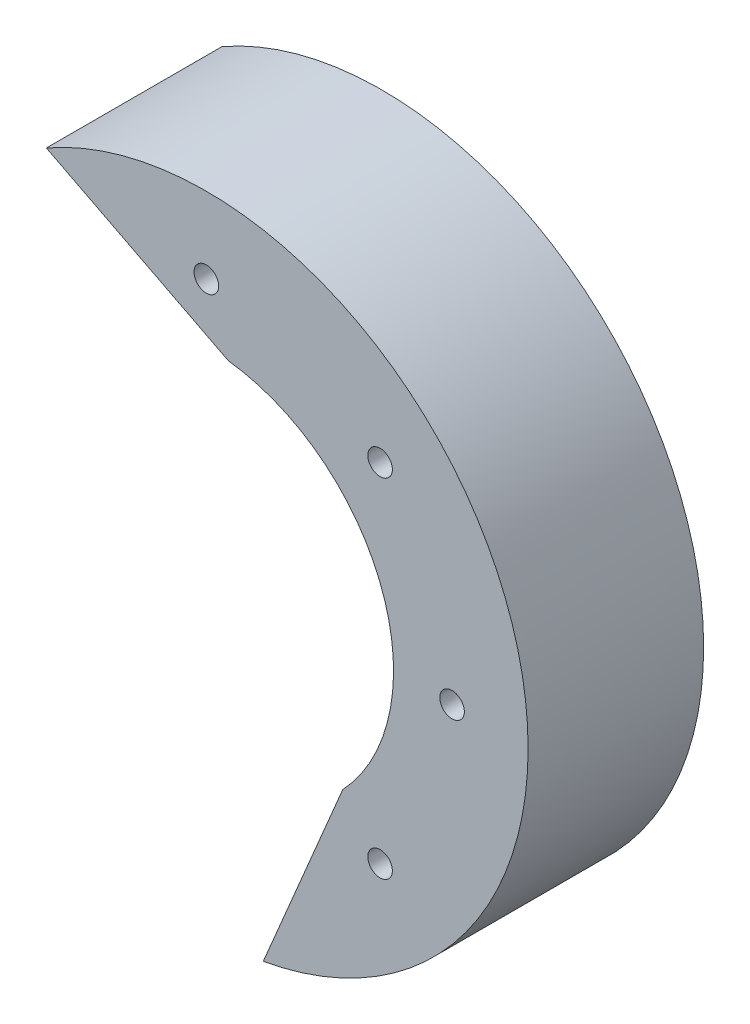
ISO-10303-21;
HEADER;
FILE_DESCRIPTION(('STEP AP214'),'2;1');
FILE_NAME('part.step','',(''),(''),'','','');
FILE_SCHEMA(('AUTOMOTIVE_DESIGN { 1 0 10303 214 1 1 1 1 }'));
ENDSEC;
DATA;
#1=APPLICATION_CONTEXT('core data for automotive mechanical design processes');
#2=APPLICATION_PROTOCOL_DEFINITION('international standard','automotive_design',2000,#1);
#3=PRODUCT_CONTEXT('',#1,'mechanical');
#4=PRODUCT('Part','Part','',(#3));
#5=PRODUCT_RELATED_PRODUCT_CATEGORY('part','',(#4));
#6=PRODUCT_DEFINITION_FORMATION('','',#4);
#7=PRODUCT_DEFINITION_CONTEXT('part definition',#1,'design');
#8=PRODUCT_DEFINITION('design','',#6,#7);
#9=PRODUCT_DEFINITION_SHAPE('','',#8);
#10=(LENGTH_UNIT() NAMED_UNIT(*) SI_UNIT(.MILLI.,.METRE.));
#11=(NAMED_UNIT(*) PLANE_ANGLE_UNIT() SI_UNIT($,.RADIAN.));
#12=(NAMED_UNIT(*) SI_UNIT($,.STERADIAN.) SOLID_ANGLE_UNIT());
#13=UNCERTAINTY_MEASURE_WITH_UNIT(LENGTH_MEASURE(1.E-05),#10,'distance_accuracy_value','');
#14=(GEOMETRIC_REPRESENTATION_CONTEXT(3) GLOBAL_UNCERTAINTY_ASSIGNED_CONTEXT((#13)) GLOBAL_UNIT_ASSIGNED_CONTEXT((#10,
#11,#12)) REPRESENTATION_CONTEXT('',''));
#15=CARTESIAN_POINT('',(0.,0.,0.));
#16=DIRECTION('',(0.,0.,1.));
#17=DIRECTION('',(1.,0.,0.));
#18=AXIS2_PLACEMENT_3D('',#15,#16,#17);
#19=CARTESIAN_POINT('',(29.698484809835,-29.698484809835,30.));
#20=DIRECTION('',(0.,0.,1.));
#21=DIRECTION('',(1.,0.,0.));
#22=AXIS2_PLACEMENT_3D('',#19,#20,#21);
#23=CYLINDRICAL_SURFACE('',#22,2.09999999999999);
#24=CARTESIAN_POINT('',(29.698484809835,-29.698484809835,30.));
#25=DIRECTION('',(0.,0.,1.));
#26=DIRECTION('',(1.,0.,0.));
#27=AXIS2_PLACEMENT_3D('',#24,#25,#26);
#28=CIRCLE('',#27,2.09999999999999);
#29=CARTESIAN_POINT('',(31.798484809835,-29.698484809835,30.));
#30=VERTEX_POINT('',#29);
#31=EDGE_CURVE('E107',#30,#30,#28,.T.);
#32=ORIENTED_EDGE('',*,*,#31,.T.);
#33=EDGE_LOOP('',(#32));
#34=FACE_BOUND('',#33,.T.);
#35=CARTESIAN_POINT('',(29.698484809835,-29.698484809835,20.));
#36=DIRECTION('',(0.,0.,-1.));
#37=DIRECTION('',(-1.,0.,0.));
#38=AXIS2_PLACEMENT_3D('',#35,#36,#37);
#39=CIRCLE('',#38,2.09999999999999);
#40=CARTESIAN_POINT('',(27.598484809835,-29.698484809835,20.));
#41=VERTEX_POINT('',#40);
#42=EDGE_CURVE('E41',#41,#41,#39,.F.);
#43=ORIENTED_EDGE('',*,*,#42,.F.);
#44=EDGE_LOOP('',(#43));
#45=FACE_BOUND('',#44,.T.);
#46=ADVANCED_FACE('F37',(#34,#45),#23,.F.);
#47=CARTESIAN_POINT('',(42.,0.,30.));
#48=DIRECTION('',(0.,0.,1.));
#49=DIRECTION('',(1.,0.,0.));
#50=AXIS2_PLACEMENT_3D('',#47,#48,#49);
#51=CYLINDRICAL_SURFACE('',#50,2.09999999999999);
#52=CARTESIAN_POINT('',(42.,0.,30.));
#53=DIRECTION('',(0.,0.,1.));
#54=DIRECTION('',(1.,0.,0.));
#55=AXIS2_PLACEMENT_3D('',#52,#53,#54);
#56=CIRCLE('',#55,2.09999999999998);
#57=CARTESIAN_POINT('',(44.1,0.,30.));
#58=VERTEX_POINT('',#57);
#59=EDGE_CURVE('E133',#58,#58,#56,.T.);
#60=ORIENTED_EDGE('',*,*,#59,.T.);
#61=EDGE_LOOP('',(#60));
#62=FACE_BOUND('',#61,.T.);
#63=CARTESIAN_POINT('',(42.,0.,20.));
#64=DIRECTION('',(0.,0.,-1.));
#65=DIRECTION('',(-1.,0.,0.));
#66=AXIS2_PLACEMENT_3D('',#63,#64,#65);
#67=CIRCLE('',#66,2.09999999999999);
#68=CARTESIAN_POINT('',(39.9,0.,20.));
#69=VERTEX_POINT('',#68);
#70=EDGE_CURVE('E119',#69,#69,#67,.F.);
#71=ORIENTED_EDGE('',*,*,#70,.F.);
#72=EDGE_LOOP('',(#71));
#73=FACE_BOUND('',#72,.T.);
#74=ADVANCED_FACE('F162',(#62,#73),#51,.F.);
#75=CARTESIAN_POINT('',(29.698484809835,29.698484809835,30.));
#76=DIRECTION('',(0.,0.,1.));
#77=DIRECTION('',(1.,0.,0.));
#78=AXIS2_PLACEMENT_3D('',#75,#76,#77);
#79=CYLINDRICAL_SURFACE('',#78,2.09999999999999);
#80=CARTESIAN_POINT('',(29.698484809835,29.698484809835,30.));
#81=DIRECTION('',(0.,0.,1.));
#82=DIRECTION('',(1.,0.,0.));
#83=AXIS2_PLACEMENT_3D('',#80,#81,#82);
#84=CIRCLE('',#83,2.09999999999999);
#85=CARTESIAN_POINT('',(31.798484809835,29.698484809835,30.));
#86=VERTEX_POINT('',#85);
#87=EDGE_CURVE('E128',#86,#86,#84,.T.);
#88=ORIENTED_EDGE('',*,*,#87,.T.);
#89=EDGE_LOOP('',(#88));
#90=FACE_BOUND('',#89,.T.);
#91=CARTESIAN_POINT('',(29.698484809835,29.698484809835,20.));
#92=DIRECTION('',(0.,0.,-1.));
#93=DIRECTION('',(-1.,0.,0.));
#94=AXIS2_PLACEMENT_3D('',#91,#92,#93);
#95=CIRCLE('',#94,2.09999999999999);
#96=CARTESIAN_POINT('',(27.598484809835,29.698484809835,20.));
#97=VERTEX_POINT('',#96);
#98=EDGE_CURVE('E116',#97,#97,#95,.F.);
#99=ORIENTED_EDGE('',*,*,#98,.F.);
#100=EDGE_LOOP('',(#99));
#101=FACE_BOUND('',#100,.T.);
#102=ADVANCED_FACE('F166',(#90,#101),#79,.F.);
#103=CARTESIAN_POINT('',(0.,42.,30.));
#104=DIRECTION('',(0.,0.,1.));
#105=DIRECTION('',(1.,0.,0.));
#106=AXIS2_PLACEMENT_3D('',#103,#104,#105);
#107=CYLINDRICAL_SURFACE('',#106,2.09999999999999);
#108=CARTESIAN_POINT('',(0.,42.,30.));
#109=DIRECTION('',(0.,0.,1.));
#110=DIRECTION('',(1.,0.,0.));
#111=AXIS2_PLACEMENT_3D('',#108,#109,#110);
#112=CIRCLE('',#111,2.09999999999999);
#113=CARTESIAN_POINT('',(2.09999999999999,42.,30.));
#114=VERTEX_POINT('',#113);
#115=EDGE_CURVE('E124',#114,#114,#112,.T.);
#116=ORIENTED_EDGE('',*,*,#115,.T.);
#117=EDGE_LOOP('',(#116));
#118=FACE_BOUND('',#117,.T.);
#119=CARTESIAN_POINT('',(0.,42.,20.));
#120=DIRECTION('',(0.,0.,-1.));
#121=DIRECTION('',(-1.,0.,0.));
#122=AXIS2_PLACEMENT_3D('',#119,#120,#121);
#123=CIRCLE('',#122,2.09999999999999);
#124=CARTESIAN_POINT('',(-2.09999999999999,42.,20.));
#125=VERTEX_POINT('',#124);
#126=EDGE_CURVE('E113',#125,#125,#123,.F.);
#127=ORIENTED_EDGE('',*,*,#126,.F.);
#128=EDGE_LOOP('',(#127));
#129=FACE_BOUND('',#128,.T.);
#130=ADVANCED_FACE('F172',(#118,#129),#107,.F.);
#131=CARTESIAN_POINT('',(0.,0.,30.));
#132=DIRECTION('',(0.,0.,-1.));
#133=DIRECTION('',(-1.,0.,0.));
#134=AXIS2_PLACEMENT_3D('',#131,#132,#133);
#135=CYLINDRICAL_SURFACE('',#134,32.);
#136=CARTESIAN_POINT('',(0.,0.,0.));
#137=DIRECTION('',(0.,0.,-1.));
#138=DIRECTION('',(1.,0.,0.));
#139=AXIS2_PLACEMENT_3D('',#136,#137,#138);
#140=CIRCLE('',#139,32.);
#141=CARTESIAN_POINT('',(3.77222328875303,31.7768836020745,0.));
#142=VERTEX_POINT('',#141);
#143=CARTESIAN_POINT('',(23.3154777424182,-21.9177667120261,0.));
#144=VERTEX_POINT('',#143);
#145=EDGE_CURVE('E104',#142,#144,#140,.T.);
#146=ORIENTED_EDGE('',*,*,#145,.T.);
#147=DIRECTION('',(0.,0.,-1.));
#148=VECTOR('',#147,1.);
#149=CARTESIAN_POINT('',(23.3154777424182,-21.9177667120261,30.));
#150=LINE('',#149,#148);
#151=CARTESIAN_POINT('',(23.3154777424182,-21.9177667120261,30.));
#152=VERTEX_POINT('',#151);
#153=EDGE_CURVE('E11',#152,#144,#150,.T.);
#154=ORIENTED_EDGE('',*,*,#153,.F.);
#155=CARTESIAN_POINT('',(0.,0.,30.));
#156=DIRECTION('',(0.,0.,-1.));
#157=DIRECTION('',(1.,0.,0.));
#158=AXIS2_PLACEMENT_3D('',#155,#156,#157);
#159=CIRCLE('',#158,32.);
#160=CARTESIAN_POINT('',(3.77222328875303,31.7768836020745,30.));
#161=VERTEX_POINT('',#160);
#162=EDGE_CURVE('E91',#161,#152,#159,.T.);
#163=ORIENTED_EDGE('',*,*,#162,.F.);
#164=DIRECTION('',(0.,0.,-1.));
#165=VECTOR('',#164,1.);
#166=CARTESIAN_POINT('',(3.77222328875303,31.7768836020745,30.));
#167=LINE('',#166,#165);
#168=EDGE_CURVE('E100',#161,#142,#167,.T.);
#169=ORIENTED_EDGE('',*,*,#168,.T.);
#170=EDGE_LOOP('',(#146,#154,#163,#169));
#171=FACE_BOUND('',#170,.T.);
#172=ADVANCED_FACE('F39',(#171),#135,.F.);
#173=CARTESIAN_POINT('',(9.7299740967662,-54.1325004417518,30.));
#174=DIRECTION('',(0.921416262789677,-0.388576981648044,0.));
#175=DIRECTION('',(0.388576981648044,0.921416262789677,0.));
#176=AXIS2_PLACEMENT_3D('',#173,#174,#175);
#177=PLANE('',#176);
#178=DIRECTION('',(-0.388576981648044,-0.921416262789677,0.));
#179=VECTOR('',#178,1.);
#180=CARTESIAN_POINT('',(9.7299740967662,-54.1325004417518,0.));
#181=LINE('',#180,#179);
#182=CARTESIAN_POINT('',(9.7299740967662,-54.1325004417518,0.));
#183=VERTEX_POINT('',#182);
#184=EDGE_CURVE('E95',#144,#183,#181,.T.);
#185=ORIENTED_EDGE('',*,*,#184,.T.);
#186=DIRECTION('',(0.,0.,-1.));
#187=VECTOR('',#186,1.);
#188=CARTESIAN_POINT('',(9.7299740967662,-54.1325004417518,30.));
#189=LINE('',#188,#187);
#190=CARTESIAN_POINT('',(9.7299740967662,-54.1325004417518,30.));
#191=VERTEX_POINT('',#190);
#192=EDGE_CURVE('E47',#191,#183,#189,.T.);
#193=ORIENTED_EDGE('',*,*,#192,.F.);
#194=DIRECTION('',(-0.388576981648044,-0.921416262789677,0.));
#195=VECTOR('',#194,1.);
#196=CARTESIAN_POINT('',(9.7299740967662,-54.1325004417518,30.));
#197=LINE('',#196,#195);
#198=EDGE_CURVE('E86',#152,#191,#197,.T.);
#199=ORIENTED_EDGE('',*,*,#198,.F.);
#200=ORIENTED_EDGE('',*,*,#153,.T.);
#201=EDGE_LOOP('',(#185,#193,#199,#200));
#202=FACE_BOUND('',#201,.T.);
#203=ADVANCED_FACE('F94',(#202),#177,.F.);
#204=CARTESIAN_POINT('',(0.,0.,30.));
#205=DIRECTION('',(0.,0.,-1.));
#206=DIRECTION('',(-1.,0.,0.));
#207=AXIS2_PLACEMENT_3D('',#204,#205,#206);
#208=CYLINDRICAL_SURFACE('',#207,55.);
#209=CARTESIAN_POINT('',(0.,0.,0.));
#210=DIRECTION('',(0.,0.,1.));
#211=DIRECTION('',(1.,0.,0.));
#212=AXIS2_PLACEMENT_3D('',#209,#210,#211);
#213=CIRCLE('',#212,55.);
#214=CARTESIAN_POINT('',(-27.3421079767901,47.7222079475117,0.));
#215=VERTEX_POINT('',#214);
#216=EDGE_CURVE('E73',#183,#215,#213,.T.);
#217=ORIENTED_EDGE('',*,*,#216,.T.);
#218=DIRECTION('',(0.,0.,-1.));
#219=VECTOR('',#218,1.);
#220=CARTESIAN_POINT('',(-27.3421079767901,47.7222079475117,30.));
#221=LINE('',#220,#219);
#222=CARTESIAN_POINT('',(-27.3421079767901,47.7222079475117,30.));
#223=VERTEX_POINT('',#222);
#224=EDGE_CURVE('E96',#223,#215,#221,.T.);
#225=ORIENTED_EDGE('',*,*,#224,.F.);
#226=CARTESIAN_POINT('',(0.,0.,30.));
#227=DIRECTION('',(0.,0.,1.));
#228=DIRECTION('',(1.,0.,0.));
#229=AXIS2_PLACEMENT_3D('',#226,#227,#228);
#230=CIRCLE('',#229,55.);
#231=EDGE_CURVE('E89',#191,#223,#230,.T.);
#232=ORIENTED_EDGE('',*,*,#231,.F.);
#233=ORIENTED_EDGE('',*,*,#192,.T.);
#234=EDGE_LOOP('',(#217,#225,#232,#233));
#235=FACE_BOUND('',#234,.T.);
#236=ADVANCED_FACE('F98',(#235),#208,.T.);
#237=CARTESIAN_POINT('',(-27.3421079767901,47.7222079475117,30.));
#238=DIRECTION('',(0.456073338696727,0.889942194600313,0.));
#239=DIRECTION('',(-0.889942194600313,0.456073338696727,0.));
#240=AXIS2_PLACEMENT_3D('',#237,#238,#239);
#241=PLANE('',#240);
#242=DIRECTION('',(0.889942194600313,-0.456073338696727,0.));
#243=VECTOR('',#242,1.);
#244=CARTESIAN_POINT('',(-27.3421079767901,47.7222079475117,0.));
#245=LINE('',#244,#243);
#246=EDGE_CURVE('E79',#215,#142,#245,.T.);
#247=ORIENTED_EDGE('',*,*,#246,.T.);
#248=ORIENTED_EDGE('',*,*,#168,.F.);
#249=DIRECTION('',(0.889942194600313,-0.456073338696727,0.));
#250=VECTOR('',#249,1.);
#251=CARTESIAN_POINT('',(-27.3421079767901,47.7222079475117,30.));
#252=LINE('',#251,#250);
#253=EDGE_CURVE('E56',#223,#161,#252,.T.);
#254=ORIENTED_EDGE('',*,*,#253,.F.);
#255=ORIENTED_EDGE('',*,*,#224,.T.);
#256=EDGE_LOOP('',(#247,#248,#254,#255));
#257=FACE_BOUND('',#256,.T.);
#258=ADVANCED_FACE('F148',(#257),#241,.F.);
#259=CARTESIAN_POINT('',(0.,0.,30.));
#260=DIRECTION('',(0.,0.,1.));
#261=DIRECTION('',(1.,0.,0.));
#262=AXIS2_PLACEMENT_3D('',#259,#260,#261);
#263=PLANE('',#262);
#264=ORIENTED_EDGE('',*,*,#115,.F.);
#265=EDGE_LOOP('',(#264));
#266=FACE_BOUND('',#265,.T.);
#267=ORIENTED_EDGE('',*,*,#87,.F.);
#268=EDGE_LOOP('',(#267));
#269=FACE_BOUND('',#268,.T.);
#270=ORIENTED_EDGE('',*,*,#59,.F.);
#271=EDGE_LOOP('',(#270));
#272=FACE_BOUND('',#271,.T.);
#273=ORIENTED_EDGE('',*,*,#31,.F.);
#274=EDGE_LOOP('',(#273));
#275=FACE_BOUND('',#274,.T.);
#276=ORIENTED_EDGE('',*,*,#162,.T.);
#277=ORIENTED_EDGE('',*,*,#198,.T.);
#278=ORIENTED_EDGE('',*,*,#231,.T.);
#279=ORIENTED_EDGE('',*,*,#253,.T.);
#280=EDGE_LOOP('',(#276,#277,#278,#279));
#281=FACE_BOUND('',#280,.T.);
#282=ADVANCED_FACE('F87',(#266,#269,#272,#275,#281),#263,.T.);
#283=CARTESIAN_POINT('',(0.,0.,0.));
#284=DIRECTION('',(0.,0.,1.));
#285=DIRECTION('',(1.,0.,0.));
#286=AXIS2_PLACEMENT_3D('',#283,#284,#285);
#287=PLANE('',#286);
#288=CARTESIAN_POINT('',(0.,42.,0.));
#289=DIRECTION('',(0.,0.,-1.));
#290=DIRECTION('',(-1.,0.,0.));
#291=AXIS2_PLACEMENT_3D('',#288,#289,#290);
#292=CIRCLE('',#291,5.);
#293=CARTESIAN_POINT('',(-5.,42.,0.));
#294=VERTEX_POINT('',#293);
#295=EDGE_CURVE('E213',#294,#294,#292,.T.);
#296=ORIENTED_EDGE('',*,*,#295,.F.);
#297=EDGE_LOOP('',(#296));
#298=FACE_BOUND('',#297,.T.);
#299=CARTESIAN_POINT('',(29.698484809835,29.698484809835,0.));
#300=DIRECTION('',(0.,0.,-1.));
#301=DIRECTION('',(-1.,0.,0.));
#302=AXIS2_PLACEMENT_3D('',#299,#300,#301);
#303=CIRCLE('',#302,5.);
#304=CARTESIAN_POINT('',(24.698484809835,29.698484809835,0.));
#305=VERTEX_POINT('',#304);
#306=EDGE_CURVE('E221',#305,#305,#303,.T.);
#307=ORIENTED_EDGE('',*,*,#306,.F.);
#308=EDGE_LOOP('',(#307));
#309=FACE_BOUND('',#308,.T.);
#310=CARTESIAN_POINT('',(42.,0.,0.));
#311=DIRECTION('',(0.,0.,-1.));
#312=DIRECTION('',(-1.,0.,0.));
#313=AXIS2_PLACEMENT_3D('',#310,#311,#312);
#314=CIRCLE('',#313,5.);
#315=CARTESIAN_POINT('',(37.,0.,0.));
#316=VERTEX_POINT('',#315);
#317=EDGE_CURVE('E227',#316,#316,#314,.T.);
#318=ORIENTED_EDGE('',*,*,#317,.F.);
#319=EDGE_LOOP('',(#318));
#320=FACE_BOUND('',#319,.T.);
#321=CARTESIAN_POINT('',(29.698484809835,-29.698484809835,0.));
#322=DIRECTION('',(0.,0.,-1.));
#323=DIRECTION('',(-1.,0.,0.));
#324=AXIS2_PLACEMENT_3D('',#321,#322,#323);
#325=CIRCLE('',#324,5.);
#326=CARTESIAN_POINT('',(24.698484809835,-29.698484809835,0.));
#327=VERTEX_POINT('',#326);
#328=EDGE_CURVE('E136',#327,#327,#325,.T.);
#329=ORIENTED_EDGE('',*,*,#328,.F.);
#330=EDGE_LOOP('',(#329));
#331=FACE_BOUND('',#330,.T.);
#332=ORIENTED_EDGE('',*,*,#145,.F.);
#333=ORIENTED_EDGE('',*,*,#246,.F.);
#334=ORIENTED_EDGE('',*,*,#216,.F.);
#335=ORIENTED_EDGE('',*,*,#184,.F.);
#336=EDGE_LOOP('',(#332,#333,#334,#335));
#337=FACE_BOUND('',#336,.T.);
#338=ADVANCED_FACE('F147',(#298,#309,#320,#331,#337),#287,.F.);
#339=CARTESIAN_POINT('',(0.,42.,20.));
#340=DIRECTION('',(0.,0.,-1.));
#341=DIRECTION('',(-1.,0.,0.));
#342=AXIS2_PLACEMENT_3D('',#339,#340,#341);
#343=PLANE('',#342);
#344=CARTESIAN_POINT('',(0.,42.,20.));
#345=DIRECTION('',(0.,0.,-1.));
#346=DIRECTION('',(-1.,0.,0.));
#347=AXIS2_PLACEMENT_3D('',#344,#345,#346);
#348=CIRCLE('',#347,5.);
#349=CARTESIAN_POINT('',(-5.,42.,20.));
#350=VERTEX_POINT('',#349);
#351=EDGE_CURVE('E117',#350,#350,#348,.T.);
#352=ORIENTED_EDGE('',*,*,#351,.T.);
#353=EDGE_LOOP('',(#352));
#354=FACE_BOUND('',#353,.T.);
#355=ORIENTED_EDGE('',*,*,#126,.T.);
#356=EDGE_LOOP('',(#355));
#357=FACE_BOUND('',#356,.T.);
#358=ADVANCED_FACE('F155',(#354,#357),#343,.T.);
#359=CARTESIAN_POINT('',(0.,42.,20.));
#360=DIRECTION('',(0.,0.,-1.));
#361=DIRECTION('',(-1.,0.,0.));
#362=AXIS2_PLACEMENT_3D('',#359,#360,#361);
#363=CYLINDRICAL_SURFACE('',#362,5.);
#364=ORIENTED_EDGE('',*,*,#351,.F.);
#365=EDGE_LOOP('',(#364));
#366=FACE_BOUND('',#365,.T.);
#367=ORIENTED_EDGE('',*,*,#295,.T.);
#368=EDGE_LOOP('',(#367));
#369=FACE_BOUND('',#368,.T.);
#370=ADVANCED_FACE('F199',(#366,#369),#363,.F.);
#371=CARTESIAN_POINT('',(29.698484809835,29.698484809835,20.));
#372=DIRECTION('',(0.,0.,-1.));
#373=DIRECTION('',(-1.,0.,0.));
#374=AXIS2_PLACEMENT_3D('',#371,#372,#373);
#375=PLANE('',#374);
#376=CARTESIAN_POINT('',(29.698484809835,29.698484809835,20.));
#377=DIRECTION('',(0.,0.,-1.));
#378=DIRECTION('',(-1.,0.,0.));
#379=AXIS2_PLACEMENT_3D('',#376,#377,#378);
#380=CIRCLE('',#379,5.);
#381=CARTESIAN_POINT('',(24.698484809835,29.698484809835,20.));
#382=VERTEX_POINT('',#381);
#383=EDGE_CURVE('E216',#382,#382,#380,.T.);
#384=ORIENTED_EDGE('',*,*,#383,.T.);
#385=EDGE_LOOP('',(#384));
#386=FACE_BOUND('',#385,.T.);
#387=ORIENTED_EDGE('',*,*,#98,.T.);
#388=EDGE_LOOP('',(#387));
#389=FACE_BOUND('',#388,.T.);
#390=ADVANCED_FACE('F195',(#386,#389),#375,.T.);
#391=CARTESIAN_POINT('',(29.698484809835,29.698484809835,20.));
#392=DIRECTION('',(0.,0.,-1.));
#393=DIRECTION('',(-1.,0.,0.));
#394=AXIS2_PLACEMENT_3D('',#391,#392,#393);
#395=CYLINDRICAL_SURFACE('',#394,5.);
#396=ORIENTED_EDGE('',*,*,#383,.F.);
#397=EDGE_LOOP('',(#396));
#398=FACE_BOUND('',#397,.T.);
#399=ORIENTED_EDGE('',*,*,#306,.T.);
#400=EDGE_LOOP('',(#399));
#401=FACE_BOUND('',#400,.T.);
#402=ADVANCED_FACE('F191',(#398,#401),#395,.F.);
#403=CARTESIAN_POINT('',(42.,0.,20.));
#404=DIRECTION('',(0.,0.,-1.));
#405=DIRECTION('',(-1.,0.,0.));
#406=AXIS2_PLACEMENT_3D('',#403,#404,#405);
#407=PLANE('',#406);
#408=CARTESIAN_POINT('',(42.,0.,20.));
#409=DIRECTION('',(0.,0.,-1.));
#410=DIRECTION('',(-1.,0.,0.));
#411=AXIS2_PLACEMENT_3D('',#408,#409,#410);
#412=CIRCLE('',#411,5.);
#413=CARTESIAN_POINT('',(37.,0.,20.));
#414=VERTEX_POINT('',#413);
#415=EDGE_CURVE('E224',#414,#414,#412,.T.);
#416=ORIENTED_EDGE('',*,*,#415,.T.);
#417=EDGE_LOOP('',(#416));
#418=FACE_BOUND('',#417,.T.);
#419=ORIENTED_EDGE('',*,*,#70,.T.);
#420=EDGE_LOOP('',(#419));
#421=FACE_BOUND('',#420,.T.);
#422=ADVANCED_FACE('F187',(#418,#421),#407,.T.);
#423=CARTESIAN_POINT('',(42.,0.,20.));
#424=DIRECTION('',(0.,0.,-1.));
#425=DIRECTION('',(-1.,0.,0.));
#426=AXIS2_PLACEMENT_3D('',#423,#424,#425);
#427=CYLINDRICAL_SURFACE('',#426,5.);
#428=ORIENTED_EDGE('',*,*,#415,.F.);
#429=EDGE_LOOP('',(#428));
#430=FACE_BOUND('',#429,.T.);
#431=ORIENTED_EDGE('',*,*,#317,.T.);
#432=EDGE_LOOP('',(#431));
#433=FACE_BOUND('',#432,.T.);
#434=ADVANCED_FACE('F183',(#430,#433),#427,.F.);
#435=CARTESIAN_POINT('',(29.698484809835,-29.698484809835,20.));
#436=DIRECTION('',(0.,0.,-1.));
#437=DIRECTION('',(-1.,0.,0.));
#438=AXIS2_PLACEMENT_3D('',#435,#436,#437);
#439=PLANE('',#438);
#440=CARTESIAN_POINT('',(29.698484809835,-29.698484809835,20.));
#441=DIRECTION('',(0.,0.,-1.));
#442=DIRECTION('',(-1.,0.,0.));
#443=AXIS2_PLACEMENT_3D('',#440,#441,#442);
#444=CIRCLE('',#443,5.);
#445=CARTESIAN_POINT('',(24.698484809835,-29.698484809835,20.));
#446=VERTEX_POINT('',#445);
#447=EDGE_CURVE('E229',#446,#446,#444,.T.);
#448=ORIENTED_EDGE('',*,*,#447,.T.);
#449=EDGE_LOOP('',(#448));
#450=FACE_BOUND('',#449,.T.);
#451=ORIENTED_EDGE('',*,*,#42,.T.);
#452=EDGE_LOOP('',(#451));
#453=FACE_BOUND('',#452,.T.);
#454=ADVANCED_FACE('F179',(#450,#453),#439,.T.);
#455=CARTESIAN_POINT('',(29.698484809835,-29.698484809835,20.));
#456=DIRECTION('',(0.,0.,-1.));
#457=DIRECTION('',(-1.,0.,0.));
#458=AXIS2_PLACEMENT_3D('',#455,#456,#457);
#459=CYLINDRICAL_SURFACE('',#458,5.);
#460=ORIENTED_EDGE('',*,*,#447,.F.);
#461=EDGE_LOOP('',(#460));
#462=FACE_BOUND('',#461,.T.);
#463=ORIENTED_EDGE('',*,*,#328,.T.);
#464=EDGE_LOOP('',(#463));
#465=FACE_BOUND('',#464,.T.);
#466=ADVANCED_FACE('F176',(#462,#465),#459,.F.);
#467=CLOSED_SHELL('',(#46,#74,#102,#130,#172,#203,#236,#258,#282,#338,#358,#370,#390,#402,#422,
#434,#454,#466));
#468=MANIFOLD_SOLID_BREP('B2',#467);
#469=ADVANCED_BREP_SHAPE_REPRESENTATION('',(#18,#468),#14);
#470=SHAPE_DEFINITION_REPRESENTATION(#9,#469);
ENDSEC;
END-ISO-10303-21;
